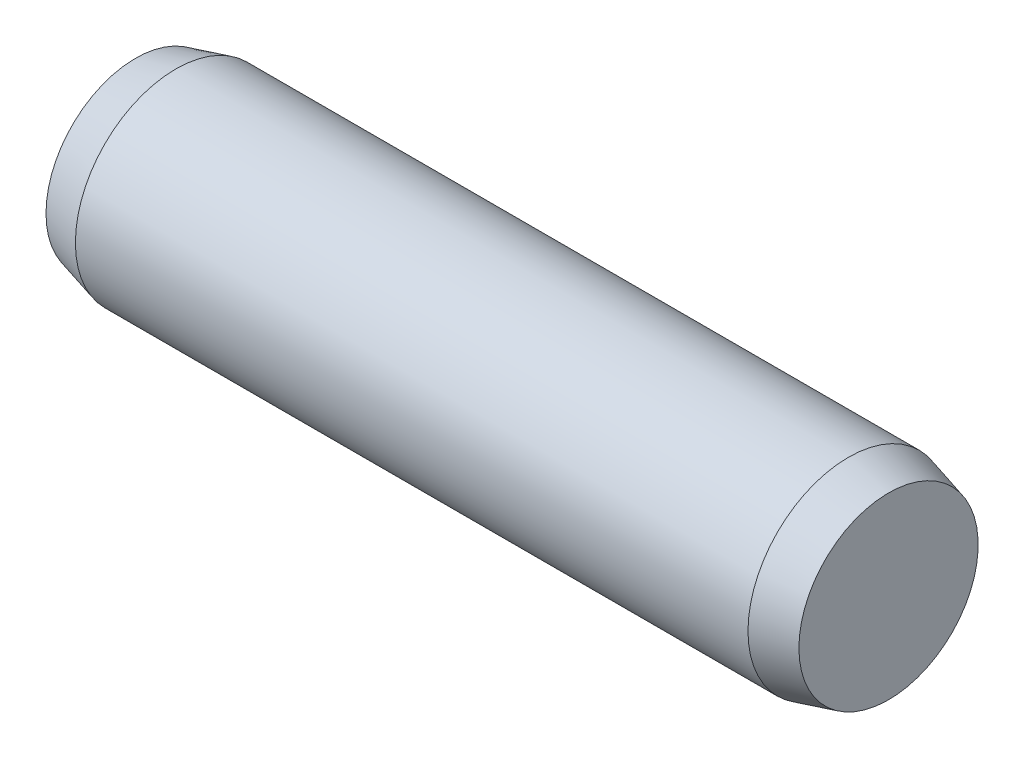
ISO-10303-21;
HEADER;
FILE_DESCRIPTION(('STEP AP214'),'2;1');
FILE_NAME('part.step','',(''),(''),'','','');
FILE_SCHEMA(('AUTOMOTIVE_DESIGN { 1 0 10303 214 1 1 1 1 }'));
ENDSEC;
DATA;
#1=APPLICATION_CONTEXT('core data for automotive mechanical design processes');
#2=APPLICATION_PROTOCOL_DEFINITION('international standard','automotive_design',2000,#1);
#3=PRODUCT_CONTEXT('',#1,'mechanical');
#4=PRODUCT('Part','Part','',(#3));
#5=PRODUCT_RELATED_PRODUCT_CATEGORY('part','',(#4));
#6=PRODUCT_DEFINITION_FORMATION('','',#4);
#7=PRODUCT_DEFINITION_CONTEXT('part definition',#1,'design');
#8=PRODUCT_DEFINITION('design','',#6,#7);
#9=PRODUCT_DEFINITION_SHAPE('','',#8);
#10=(LENGTH_UNIT() NAMED_UNIT(*) SI_UNIT(.MILLI.,.METRE.));
#11=(NAMED_UNIT(*) PLANE_ANGLE_UNIT() SI_UNIT($,.RADIAN.));
#12=(NAMED_UNIT(*) SI_UNIT($,.STERADIAN.) SOLID_ANGLE_UNIT());
#13=UNCERTAINTY_MEASURE_WITH_UNIT(LENGTH_MEASURE(1.E-05),#10,'distance_accuracy_value','');
#14=(GEOMETRIC_REPRESENTATION_CONTEXT(3) GLOBAL_UNCERTAINTY_ASSIGNED_CONTEXT((#13)) GLOBAL_UNIT_ASSIGNED_CONTEXT((#10,
#11,#12)) REPRESENTATION_CONTEXT('',''));
#15=CARTESIAN_POINT('',(0.,0.,0.));
#16=DIRECTION('',(0.,0.,1.));
#17=DIRECTION('',(1.,0.,0.));
#18=AXIS2_PLACEMENT_3D('',#15,#16,#17);
#19=CARTESIAN_POINT('',(0.,0.35712812921102,0.));
#20=DIRECTION('',(1.,0.,0.));
#21=DIRECTION('',(0.,0.,-1.));
#22=AXIS2_PLACEMENT_3D('',#19,#20,#21);
#23=PLANE('',#22);
#24=CARTESIAN_POINT('',(0.,0.,0.));
#25=DIRECTION('',(-1.,0.,0.));
#26=DIRECTION('',(0.,0.,1.));
#27=AXIS2_PLACEMENT_3D('',#24,#25,#26);
#28=CIRCLE('',#27,0.35712812921102);
#29=CARTESIAN_POINT('',(0.,0.,0.35712812921102));
#30=VERTEX_POINT('',#29);
#31=EDGE_CURVE('E10',#30,#30,#28,.T.);
#32=ORIENTED_EDGE('',*,*,#31,.T.);
#33=EDGE_LOOP('',(#32));
#34=FACE_BOUND('',#33,.T.);
#35=ADVANCED_FACE('F30',(#34),#23,.F.);
#36=CARTESIAN_POINT('',(0.16,0.,0.));
#37=DIRECTION('',(1.,0.,0.));
#38=DIRECTION('',(0.,0.,-1.));
#39=AXIS2_PLACEMENT_3D('',#36,#37,#38);
#40=CONICAL_SURFACE('',#39,0.4,0.261799387799151);
#41=ORIENTED_EDGE('',*,*,#31,.F.);
#42=EDGE_LOOP('',(#41));
#43=FACE_BOUND('',#42,.T.);
#44=CARTESIAN_POINT('',(0.16,0.,0.));
#45=DIRECTION('',(-1.,0.,0.));
#46=DIRECTION('',(0.,0.,1.));
#47=AXIS2_PLACEMENT_3D('',#44,#45,#46);
#48=CIRCLE('',#47,0.4);
#49=CARTESIAN_POINT('',(0.16,0.,0.4));
#50=VERTEX_POINT('',#49);
#51=EDGE_CURVE('E36',#50,#50,#48,.T.);
#52=ORIENTED_EDGE('',*,*,#51,.T.);
#53=EDGE_LOOP('',(#52));
#54=FACE_BOUND('',#53,.T.);
#55=ADVANCED_FACE('F62',(#43,#54),#40,.T.);
#56=CARTESIAN_POINT('',(-1.65571726559622,0.,0.));
#57=DIRECTION('',(-1.,0.,0.));
#58=DIRECTION('',(0.,0.,1.));
#59=AXIS2_PLACEMENT_3D('',#56,#57,#58);
#60=CYLINDRICAL_SURFACE('',#59,0.4);
#61=ORIENTED_EDGE('',*,*,#51,.F.);
#62=EDGE_LOOP('',(#61));
#63=FACE_BOUND('',#62,.T.);
#64=CARTESIAN_POINT('',(2.84,0.,0.));
#65=DIRECTION('',(-1.,0.,0.));
#66=DIRECTION('',(0.,0.,1.));
#67=AXIS2_PLACEMENT_3D('',#64,#65,#66);
#68=CIRCLE('',#67,0.4);
#69=CARTESIAN_POINT('',(2.84,0.,0.4));
#70=VERTEX_POINT('',#69);
#71=EDGE_CURVE('E40',#70,#70,#68,.T.);
#72=ORIENTED_EDGE('',*,*,#71,.T.);
#73=EDGE_LOOP('',(#72));
#74=FACE_BOUND('',#73,.T.);
#75=ADVANCED_FACE('F58',(#63,#74),#60,.T.);
#76=CARTESIAN_POINT('',(3.,0.,0.));
#77=DIRECTION('',(-1.,0.,0.));
#78=DIRECTION('',(0.,0.,1.));
#79=AXIS2_PLACEMENT_3D('',#76,#77,#78);
#80=CONICAL_SURFACE('',#79,0.35712812921102,0.261799387799149);
#81=ORIENTED_EDGE('',*,*,#71,.F.);
#82=EDGE_LOOP('',(#81));
#83=FACE_BOUND('',#82,.T.);
#84=CARTESIAN_POINT('',(3.,0.,0.));
#85=DIRECTION('',(-1.,0.,0.));
#86=DIRECTION('',(0.,0.,1.));
#87=AXIS2_PLACEMENT_3D('',#84,#85,#86);
#88=CIRCLE('',#87,0.35712812921102);
#89=CARTESIAN_POINT('',(3.,0.,0.35712812921102));
#90=VERTEX_POINT('',#89);
#91=EDGE_CURVE('E44',#90,#90,#88,.T.);
#92=ORIENTED_EDGE('',*,*,#91,.T.);
#93=EDGE_LOOP('',(#92));
#94=FACE_BOUND('',#93,.T.);
#95=ADVANCED_FACE('F50',(#83,#94),#80,.T.);
#96=CARTESIAN_POINT('',(3.,0.,0.));
#97=DIRECTION('',(-1.,0.,0.));
#98=DIRECTION('',(0.,0.,1.));
#99=AXIS2_PLACEMENT_3D('',#96,#97,#98);
#100=PLANE('',#99);
#101=ORIENTED_EDGE('',*,*,#91,.F.);
#102=EDGE_LOOP('',(#101));
#103=FACE_BOUND('',#102,.T.);
#104=ADVANCED_FACE('F52',(#103),#100,.F.);
#105=CLOSED_SHELL('',(#35,#55,#75,#95,#104));
#106=MANIFOLD_SOLID_BREP('B2',#105);
#107=ADVANCED_BREP_SHAPE_REPRESENTATION('',(#18,#106),#14);
#108=SHAPE_DEFINITION_REPRESENTATION(#9,#107);
ENDSEC;
END-ISO-10303-21;
